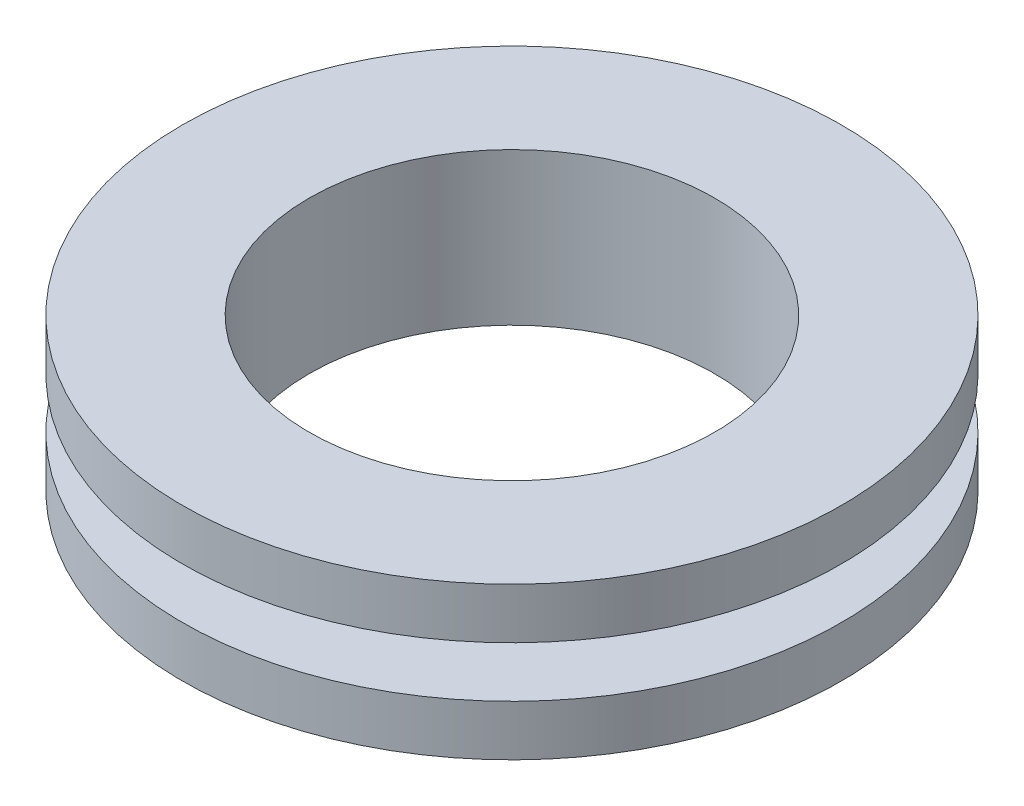
ISO-10303-21;
HEADER;
FILE_DESCRIPTION(('STEP AP214'),'2;1');
FILE_NAME('part.step','',(''),(''),'','','');
FILE_SCHEMA(('AUTOMOTIVE_DESIGN { 1 0 10303 214 1 1 1 1 }'));
ENDSEC;
DATA;
#1=APPLICATION_CONTEXT('core data for automotive mechanical design processes');
#2=APPLICATION_PROTOCOL_DEFINITION('international standard','automotive_design',2000,#1);
#3=PRODUCT_CONTEXT('',#1,'mechanical');
#4=PRODUCT('Part','Part','',(#3));
#5=PRODUCT_RELATED_PRODUCT_CATEGORY('part','',(#4));
#6=PRODUCT_DEFINITION_FORMATION('','',#4);
#7=PRODUCT_DEFINITION_CONTEXT('part definition',#1,'design');
#8=PRODUCT_DEFINITION('design','',#6,#7);
#9=PRODUCT_DEFINITION_SHAPE('','',#8);
#10=(LENGTH_UNIT() NAMED_UNIT(*) SI_UNIT(.MILLI.,.METRE.));
#11=(NAMED_UNIT(*) PLANE_ANGLE_UNIT() SI_UNIT($,.RADIAN.));
#12=(NAMED_UNIT(*) SI_UNIT($,.STERADIAN.) SOLID_ANGLE_UNIT());
#13=UNCERTAINTY_MEASURE_WITH_UNIT(LENGTH_MEASURE(1.E-05),#10,'distance_accuracy_value','');
#14=(GEOMETRIC_REPRESENTATION_CONTEXT(3) GLOBAL_UNCERTAINTY_ASSIGNED_CONTEXT((#13)) GLOBAL_UNIT_ASSIGNED_CONTEXT((#10,
#11,#12)) REPRESENTATION_CONTEXT('',''));
#15=CARTESIAN_POINT('',(0.,0.,0.));
#16=DIRECTION('',(0.,0.,1.));
#17=DIRECTION('',(1.,0.,0.));
#18=AXIS2_PLACEMENT_3D('',#15,#16,#17);
#19=CARTESIAN_POINT('',(5.,0.5,0.));
#20=DIRECTION('',(0.,1.,0.));
#21=DIRECTION('',(-1.,0.,0.));
#22=AXIS2_PLACEMENT_3D('',#19,#20,#21);
#23=PLANE('',#22);
#24=CARTESIAN_POINT('',(0.,0.499999999999999,0.));
#25=DIRECTION('',(0.,1.,0.));
#26=DIRECTION('',(-1.,0.,0.));
#27=AXIS2_PLACEMENT_3D('',#24,#25,#26);
#28=CIRCLE('',#27,6.5);
#29=CARTESIAN_POINT('',(-6.5,0.499999999999998,0.));
#30=VERTEX_POINT('',#29);
#31=EDGE_CURVE('E10',#30,#30,#28,.T.);
#32=ORIENTED_EDGE('',*,*,#31,.F.);
#33=EDGE_LOOP('',(#32));
#34=FACE_BOUND('',#33,.T.);
#35=CARTESIAN_POINT('',(0.,0.5,0.));
#36=DIRECTION('',(0.,1.,0.));
#37=DIRECTION('',(-1.,0.,0.));
#38=AXIS2_PLACEMENT_3D('',#35,#36,#37);
#39=CIRCLE('',#38,5.);
#40=CARTESIAN_POINT('',(-5.,0.499999999999999,0.));
#41=VERTEX_POINT('',#40);
#42=EDGE_CURVE('E67',#41,#41,#39,.T.);
#43=ORIENTED_EDGE('',*,*,#42,.T.);
#44=EDGE_LOOP('',(#43));
#45=FACE_BOUND('',#44,.T.);
#46=ADVANCED_FACE('F39',(#34,#45),#23,.F.);
#47=CARTESIAN_POINT('',(0.,3.8001500254323,0.));
#48=DIRECTION('',(0.,1.,0.));
#49=DIRECTION('',(-1.,0.,0.));
#50=AXIS2_PLACEMENT_3D('',#47,#48,#49);
#51=CYLINDRICAL_SURFACE('',#50,6.5);
#52=CARTESIAN_POINT('',(0.,1.5,0.));
#53=DIRECTION('',(0.,1.,0.));
#54=DIRECTION('',(-1.,0.,0.));
#55=AXIS2_PLACEMENT_3D('',#52,#53,#54);
#56=CIRCLE('',#55,6.5);
#57=CARTESIAN_POINT('',(-6.5,1.5,0.));
#58=VERTEX_POINT('',#57);
#59=EDGE_CURVE('E45',#58,#58,#56,.T.);
#60=ORIENTED_EDGE('',*,*,#59,.F.);
#61=EDGE_LOOP('',(#60));
#62=FACE_BOUND('',#61,.T.);
#63=ORIENTED_EDGE('',*,*,#31,.T.);
#64=EDGE_LOOP('',(#63));
#65=FACE_BOUND('',#64,.T.);
#66=ADVANCED_FACE('F104',(#62,#65),#51,.T.);
#67=CARTESIAN_POINT('',(6.5,1.5,0.));
#68=DIRECTION('',(0.,-1.,0.));
#69=DIRECTION('',(1.,0.,0.));
#70=AXIS2_PLACEMENT_3D('',#67,#68,#69);
#71=PLANE('',#70);
#72=CARTESIAN_POINT('',(0.,1.5,0.));
#73=DIRECTION('',(0.,1.,0.));
#74=DIRECTION('',(-1.,0.,0.));
#75=AXIS2_PLACEMENT_3D('',#72,#73,#74);
#76=CIRCLE('',#75,4.);
#77=CARTESIAN_POINT('',(-4.,1.5,0.));
#78=VERTEX_POINT('',#77);
#79=EDGE_CURVE('E49',#78,#78,#76,.T.);
#80=ORIENTED_EDGE('',*,*,#79,.F.);
#81=EDGE_LOOP('',(#80));
#82=FACE_BOUND('',#81,.T.);
#83=ORIENTED_EDGE('',*,*,#59,.T.);
#84=EDGE_LOOP('',(#83));
#85=FACE_BOUND('',#84,.T.);
#86=ADVANCED_FACE('F99',(#82,#85),#71,.F.);
#87=CARTESIAN_POINT('',(0.,3.8001500254323,0.));
#88=DIRECTION('',(0.,1.,0.));
#89=DIRECTION('',(-1.,0.,0.));
#90=AXIS2_PLACEMENT_3D('',#87,#88,#89);
#91=CYLINDRICAL_SURFACE('',#90,4.);
#92=CARTESIAN_POINT('',(0.,-1.5,0.));
#93=DIRECTION('',(0.,1.,0.));
#94=DIRECTION('',(-1.,0.,0.));
#95=AXIS2_PLACEMENT_3D('',#92,#93,#94);
#96=CIRCLE('',#95,4.);
#97=CARTESIAN_POINT('',(-4.,-1.5,0.));
#98=VERTEX_POINT('',#97);
#99=EDGE_CURVE('E53',#98,#98,#96,.T.);
#100=ORIENTED_EDGE('',*,*,#99,.F.);
#101=EDGE_LOOP('',(#100));
#102=FACE_BOUND('',#101,.T.);
#103=ORIENTED_EDGE('',*,*,#79,.T.);
#104=EDGE_LOOP('',(#103));
#105=FACE_BOUND('',#104,.T.);
#106=ADVANCED_FACE('F93',(#102,#105),#91,.F.);
#107=CARTESIAN_POINT('',(4.,-1.5,0.));
#108=DIRECTION('',(0.,1.,0.));
#109=DIRECTION('',(-1.,0.,0.));
#110=AXIS2_PLACEMENT_3D('',#107,#108,#109);
#111=PLANE('',#110);
#112=CARTESIAN_POINT('',(0.,-1.5,0.));
#113=DIRECTION('',(0.,1.,0.));
#114=DIRECTION('',(-1.,0.,0.));
#115=AXIS2_PLACEMENT_3D('',#112,#113,#114);
#116=CIRCLE('',#115,6.5);
#117=CARTESIAN_POINT('',(-6.5,-1.5,0.));
#118=VERTEX_POINT('',#117);
#119=EDGE_CURVE('E58',#118,#118,#116,.T.);
#120=ORIENTED_EDGE('',*,*,#119,.F.);
#121=EDGE_LOOP('',(#120));
#122=FACE_BOUND('',#121,.T.);
#123=ORIENTED_EDGE('',*,*,#99,.T.);
#124=EDGE_LOOP('',(#123));
#125=FACE_BOUND('',#124,.T.);
#126=ADVANCED_FACE('F87',(#122,#125),#111,.F.);
#127=CARTESIAN_POINT('',(0.,3.8001500254323,0.));
#128=DIRECTION('',(0.,1.,0.));
#129=DIRECTION('',(-1.,0.,0.));
#130=AXIS2_PLACEMENT_3D('',#127,#128,#129);
#131=CYLINDRICAL_SURFACE('',#130,6.5);
#132=CARTESIAN_POINT('',(0.,-0.500000000000001,0.));
#133=DIRECTION('',(0.,1.,0.));
#134=DIRECTION('',(-1.,0.,0.));
#135=AXIS2_PLACEMENT_3D('',#132,#133,#134);
#136=CIRCLE('',#135,6.5);
#137=CARTESIAN_POINT('',(-6.5,-0.500000000000002,0.));
#138=VERTEX_POINT('',#137);
#139=EDGE_CURVE('E61',#138,#138,#136,.T.);
#140=ORIENTED_EDGE('',*,*,#139,.F.);
#141=EDGE_LOOP('',(#140));
#142=FACE_BOUND('',#141,.T.);
#143=ORIENTED_EDGE('',*,*,#119,.T.);
#144=EDGE_LOOP('',(#143));
#145=FACE_BOUND('',#144,.T.);
#146=ADVANCED_FACE('F81',(#142,#145),#131,.T.);
#147=CARTESIAN_POINT('',(5.,-0.5,0.));
#148=DIRECTION('',(0.,-1.,0.));
#149=DIRECTION('',(1.,0.,0.));
#150=AXIS2_PLACEMENT_3D('',#147,#148,#149);
#151=PLANE('',#150);
#152=CARTESIAN_POINT('',(0.,-0.500000000000001,0.));
#153=DIRECTION('',(0.,1.,0.));
#154=DIRECTION('',(-1.,0.,0.));
#155=AXIS2_PLACEMENT_3D('',#152,#153,#154);
#156=CIRCLE('',#155,5.);
#157=CARTESIAN_POINT('',(-5.,-0.500000000000002,0.));
#158=VERTEX_POINT('',#157);
#159=EDGE_CURVE('E64',#158,#158,#156,.T.);
#160=ORIENTED_EDGE('',*,*,#159,.F.);
#161=EDGE_LOOP('',(#160));
#162=FACE_BOUND('',#161,.T.);
#163=ORIENTED_EDGE('',*,*,#139,.T.);
#164=EDGE_LOOP('',(#163));
#165=FACE_BOUND('',#164,.T.);
#166=ADVANCED_FACE('F75',(#162,#165),#151,.F.);
#167=CARTESIAN_POINT('',(0.,3.8001500254323,0.));
#168=DIRECTION('',(0.,1.,0.));
#169=DIRECTION('',(-1.,0.,0.));
#170=AXIS2_PLACEMENT_3D('',#167,#168,#169);
#171=CYLINDRICAL_SURFACE('',#170,5.);
#172=ORIENTED_EDGE('',*,*,#42,.F.);
#173=EDGE_LOOP('',(#172));
#174=FACE_BOUND('',#173,.T.);
#175=ORIENTED_EDGE('',*,*,#159,.T.);
#176=EDGE_LOOP('',(#175));
#177=FACE_BOUND('',#176,.T.);
#178=ADVANCED_FACE('F72',(#174,#177),#171,.T.);
#179=CLOSED_SHELL('',(#46,#66,#86,#106,#126,#146,#166,#178));
#180=MANIFOLD_SOLID_BREP('B2',#179);
#181=ADVANCED_BREP_SHAPE_REPRESENTATION('',(#18,#180),#14);
#182=SHAPE_DEFINITION_REPRESENTATION(#9,#181);
ENDSEC;
END-ISO-10303-21;
